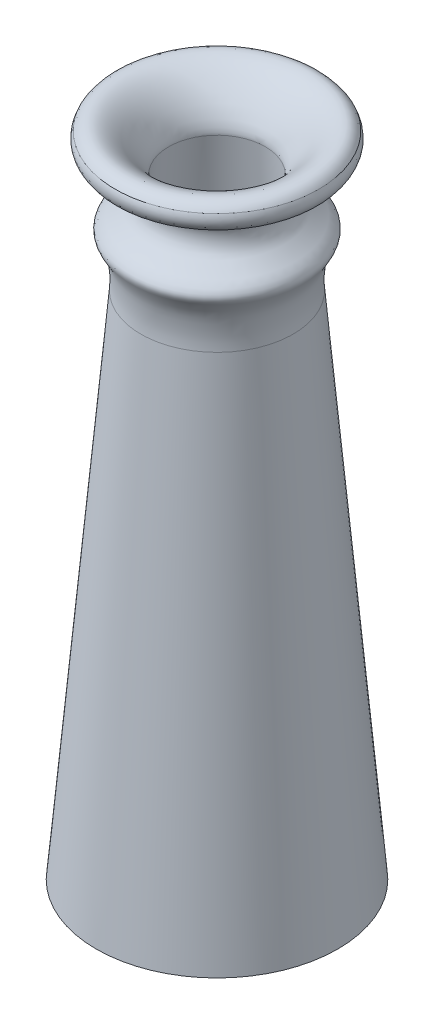
ISO-10303-21;
HEADER;
FILE_DESCRIPTION(('STEP AP214'),'2;1');
FILE_NAME('part.step','',(''),(''),'','','');
FILE_SCHEMA(('AUTOMOTIVE_DESIGN { 1 0 10303 214 1 1 1 1 }'));
ENDSEC;
DATA;
#1=APPLICATION_CONTEXT('core data for automotive mechanical design processes');
#2=APPLICATION_PROTOCOL_DEFINITION('international standard','automotive_design',2000,#1);
#3=PRODUCT_CONTEXT('',#1,'mechanical');
#4=PRODUCT('Part','Part','',(#3));
#5=PRODUCT_RELATED_PRODUCT_CATEGORY('part','',(#4));
#6=PRODUCT_DEFINITION_FORMATION('','',#4);
#7=PRODUCT_DEFINITION_CONTEXT('part definition',#1,'design');
#8=PRODUCT_DEFINITION('design','',#6,#7);
#9=PRODUCT_DEFINITION_SHAPE('','',#8);
#10=(LENGTH_UNIT() NAMED_UNIT(*) SI_UNIT(.MILLI.,.METRE.));
#11=(NAMED_UNIT(*) PLANE_ANGLE_UNIT() SI_UNIT($,.RADIAN.));
#12=(NAMED_UNIT(*) SI_UNIT($,.STERADIAN.) SOLID_ANGLE_UNIT());
#13=UNCERTAINTY_MEASURE_WITH_UNIT(LENGTH_MEASURE(1.E-05),#10,'distance_accuracy_value','');
#14=(GEOMETRIC_REPRESENTATION_CONTEXT(3) GLOBAL_UNCERTAINTY_ASSIGNED_CONTEXT((#13)) GLOBAL_UNIT_ASSIGNED_CONTEXT((#10,
#11,#12)) REPRESENTATION_CONTEXT('',''));
#15=CARTESIAN_POINT('',(0.,0.,0.));
#16=DIRECTION('',(0.,0.,1.));
#17=DIRECTION('',(1.,0.,0.));
#18=AXIS2_PLACEMENT_3D('',#15,#16,#17);
#19=CARTESIAN_POINT('',(-31.665,0.,0.));
#20=DIRECTION('',(0.,1.,0.));
#21=DIRECTION('',(0.,0.,1.));
#22=AXIS2_PLACEMENT_3D('',#19,#20,#21);
#23=PLANE('',#22);
#24=CARTESIAN_POINT('',(0.,0.,0.));
#25=DIRECTION('',(0.,-1.,0.));
#26=DIRECTION('',(0.,0.,-1.));
#27=AXIS2_PLACEMENT_3D('',#24,#25,#26);
#28=CIRCLE('',#27,26.665);
#29=CARTESIAN_POINT('',(0.,0.,-26.665));
#30=VERTEX_POINT('',#29);
#31=EDGE_CURVE('E68',#30,#30,#28,.T.);
#32=ORIENTED_EDGE('',*,*,#31,.F.);
#33=EDGE_LOOP('',(#32));
#34=FACE_BOUND('',#33,.T.);
#35=CARTESIAN_POINT('',(0.,0.,0.));
#36=DIRECTION('',(0.,-1.,0.));
#37=DIRECTION('',(0.,0.,-1.));
#38=AXIS2_PLACEMENT_3D('',#35,#36,#37);
#39=CIRCLE('',#38,31.665);
#40=CARTESIAN_POINT('',(0.,0.,-31.665));
#41=VERTEX_POINT('',#40);
#42=EDGE_CURVE('E10',#41,#41,#39,.T.);
#43=ORIENTED_EDGE('',*,*,#42,.T.);
#44=EDGE_LOOP('',(#43));
#45=FACE_BOUND('',#44,.T.);
#46=ADVANCED_FACE('F37',(#34,#45),#23,.F.);
#47=CARTESIAN_POINT('',(0.,133.75699368617,0.));
#48=DIRECTION('',(0.,-1.,0.));
#49=DIRECTION('',(0.,0.,-1.));
#50=AXIS2_PLACEMENT_3D('',#47,#48,#49);
#51=CONICAL_SURFACE('',#50,19.9627793851511,0.0872664625997201);
#52=ORIENTED_EDGE('',*,*,#42,.F.);
#53=EDGE_LOOP('',(#52));
#54=FACE_BOUND('',#53,.T.);
#55=CARTESIAN_POINT('',(0.,133.75699368617,0.));
#56=DIRECTION('',(0.,-1.,0.));
#57=DIRECTION('',(0.,0.,-1.));
#58=AXIS2_PLACEMENT_3D('',#55,#56,#57);
#59=CIRCLE('',#58,19.9627793851511);
#60=CARTESIAN_POINT('',(0.,133.75699368617,-19.9627793851511));
#61=VERTEX_POINT('',#60);
#62=EDGE_CURVE('E44',#61,#61,#59,.T.);
#63=ORIENTED_EDGE('',*,*,#62,.T.);
#64=EDGE_LOOP('',(#63));
#65=FACE_BOUND('',#64,.T.);
#66=ADVANCED_FACE('F88',(#54,#65),#51,.T.);
#67=CARTESIAN_POINT('',(-17.9593281831671,161.106450180206,0.));
#68=CARTESIAN_POINT('',(-15.2948316486188,159.923164093432,0.));
#69=CARTESIAN_POINT('',(-15.4745132644605,153.742286345859,0.));
#70=CARTESIAN_POINT('',(-20.4174883404645,151.432742662694,0.));
#71=CARTESIAN_POINT('',(-23.7524583437181,147.815263671226,0.));
#72=CARTESIAN_POINT('',(-20.5486549769959,143.942393039582,0.));
#73=CARTESIAN_POINT('',(-19.8861375274781,138.797475760651,0.));
#74=CARTESIAN_POINT('',(-19.7664352835587,136.001217036709,0.));
#75=CARTESIAN_POINT('',(-19.9627793851511,133.75699368617,0.));
#76=B_SPLINE_CURVE_WITH_KNOTS('',3,(#67,#68,#69,#70,#71,#72,#73,#74,#75),.UNSPECIFIED.,.F.,.F.,
(4,1,1,1,1,1,4),(0.,0.247129658361633,0.423699062897289,0.532203519282829,0.643266943950846,
0.840064637985073,1.),.UNSPECIFIED.);
#77=CARTESIAN_POINT('',(0.,0.,0.));
#78=DIRECTION('',(0.,-1.,0.));
#79=AXIS1_PLACEMENT('',#77,#78);
#80=SURFACE_OF_REVOLUTION('',#76,#79);
#81=ORIENTED_EDGE('',*,*,#62,.F.);
#82=EDGE_LOOP('',(#81));
#83=FACE_BOUND('',#82,.T.);
#84=CARTESIAN_POINT('',(0.,161.106450180206,0.));
#85=DIRECTION('',(0.,-1.,0.));
#86=DIRECTION('',(0.,0.,-1.));
#87=AXIS2_PLACEMENT_3D('',#84,#85,#86);
#88=CIRCLE('',#87,17.9593281831671);
#89=CARTESIAN_POINT('',(0.,161.106450180206,-17.9593281831671));
#90=VERTEX_POINT('',#89);
#91=EDGE_CURVE('E49',#90,#90,#88,.T.);
#92=ORIENTED_EDGE('',*,*,#91,.T.);
#93=EDGE_LOOP('',(#92));
#94=FACE_BOUND('',#93,.T.);
#95=ADVANCED_FACE('F84',(#83,#94),#80,.T.);
#96=CARTESIAN_POINT('',(0.,165.941771752351,0.));
#97=DIRECTION('',(0.,1.,0.));
#98=DIRECTION('',(0.,0.,1.));
#99=AXIS2_PLACEMENT_3D('',#96,#97,#98);
#100=CONICAL_SURFACE('',#99,26.1810663675703,1.03916217485036);
#101=ORIENTED_EDGE('',*,*,#91,.F.);
#102=EDGE_LOOP('',(#101));
#103=FACE_BOUND('',#102,.T.);
#104=CARTESIAN_POINT('',(0.,165.941771752351,0.));
#105=DIRECTION('',(0.,-1.,0.));
#106=DIRECTION('',(0.,0.,-1.));
#107=AXIS2_PLACEMENT_3D('',#104,#105,#106);
#108=CIRCLE('',#107,26.1810663675703);
#109=CARTESIAN_POINT('',(0.,165.941771752351,-26.1810663675703));
#110=VERTEX_POINT('',#109);
#111=EDGE_CURVE('E54',#110,#110,#108,.T.);
#112=ORIENTED_EDGE('',*,*,#111,.T.);
#113=EDGE_LOOP('',(#112));
#114=FACE_BOUND('',#113,.T.);
#115=ADVANCED_FACE('F87',(#103,#114),#100,.T.);
#116=CARTESIAN_POINT('',(-26.6668138358516,170.,0.));
#117=CARTESIAN_POINT('',(-27.7543859055921,167.821657288995,0.));
#118=CARTESIAN_POINT('',(-26.1810663675703,165.941771752351,0.));
#119=B_SPLINE_CURVE_WITH_KNOTS('',2,(#116,#117,#118),.UNSPECIFIED.,.F.,.F.,(3,3),(0.,1.),.UNSPECIFIED.);
#120=CARTESIAN_POINT('',(0.,0.,0.));
#121=DIRECTION('',(0.,-1.,0.));
#122=AXIS1_PLACEMENT('',#120,#121);
#123=SURFACE_OF_REVOLUTION('',#119,#122);
#124=ORIENTED_EDGE('',*,*,#111,.F.);
#125=EDGE_LOOP('',(#124));
#126=FACE_BOUND('',#125,.T.);
#127=CARTESIAN_POINT('',(0.,170.,0.));
#128=DIRECTION('',(0.,-1.,0.));
#129=DIRECTION('',(0.,0.,-1.));
#130=AXIS2_PLACEMENT_3D('',#127,#128,#129);
#131=CIRCLE('',#130,26.6668138358516);
#132=CARTESIAN_POINT('',(0.,170.,-26.6668138358516));
#133=VERTEX_POINT('',#132);
#134=EDGE_CURVE('E60',#133,#133,#131,.T.);
#135=ORIENTED_EDGE('',*,*,#134,.T.);
#136=EDGE_LOOP('',(#135));
#137=FACE_BOUND('',#136,.T.);
#138=ADVANCED_FACE('F109',(#126,#137),#123,.T.);
#139=CARTESIAN_POINT('',(-12.6668138358516,160.,0.));
#140=CARTESIAN_POINT('',(-12.3060637934095,164.123391853336,0.));
#141=CARTESIAN_POINT('',(-22.5938411275812,176.138404534823,0.));
#142=CARTESIAN_POINT('',(-26.6668138358516,170.,0.));
#143=B_SPLINE_CURVE_WITH_KNOTS('',3,(#139,#140,#141,#142),.UNSPECIFIED.,.F.,.F.,(4,4),(0.,1.),.UNSPECIFIED.);
#144=CARTESIAN_POINT('',(0.,0.,0.));
#145=DIRECTION('',(0.,-1.,0.));
#146=AXIS1_PLACEMENT('',#144,#145);
#147=SURFACE_OF_REVOLUTION('',#143,#146);
#148=ORIENTED_EDGE('',*,*,#134,.F.);
#149=EDGE_LOOP('',(#148));
#150=FACE_BOUND('',#149,.T.);
#151=CARTESIAN_POINT('',(0.,160.,0.));
#152=DIRECTION('',(0.,-1.,0.));
#153=DIRECTION('',(0.,0.,-1.));
#154=AXIS2_PLACEMENT_3D('',#151,#152,#153);
#155=CIRCLE('',#154,12.6668138358516);
#156=CARTESIAN_POINT('',(0.,160.,-12.6668138358516));
#157=VERTEX_POINT('',#156);
#158=EDGE_CURVE('E64',#157,#157,#155,.T.);
#159=ORIENTED_EDGE('',*,*,#158,.T.);
#160=EDGE_LOOP('',(#159));
#161=FACE_BOUND('',#160,.T.);
#162=ADVANCED_FACE('F103',(#150,#161),#147,.T.);
#163=CARTESIAN_POINT('',(0.,0.,0.));
#164=DIRECTION('',(0.,-1.,0.));
#165=DIRECTION('',(0.,0.,-1.));
#166=AXIS2_PLACEMENT_3D('',#163,#164,#165);
#167=CONICAL_SURFACE('',#166,26.665,0.0872664625997206);
#168=ORIENTED_EDGE('',*,*,#158,.F.);
#169=EDGE_LOOP('',(#168));
#170=FACE_BOUND('',#169,.T.);
#171=ORIENTED_EDGE('',*,*,#31,.T.);
#172=EDGE_LOOP('',(#171));
#173=FACE_BOUND('',#172,.T.);
#174=ADVANCED_FACE('F101',(#170,#173),#167,.F.);
#175=CLOSED_SHELL('',(#46,#66,#95,#115,#138,#162,#174));
#176=MANIFOLD_SOLID_BREP('B2',#175);
#177=ADVANCED_BREP_SHAPE_REPRESENTATION('',(#18,#176),#14);
#178=SHAPE_DEFINITION_REPRESENTATION(#9,#177);
ENDSEC;
END-ISO-10303-21;
